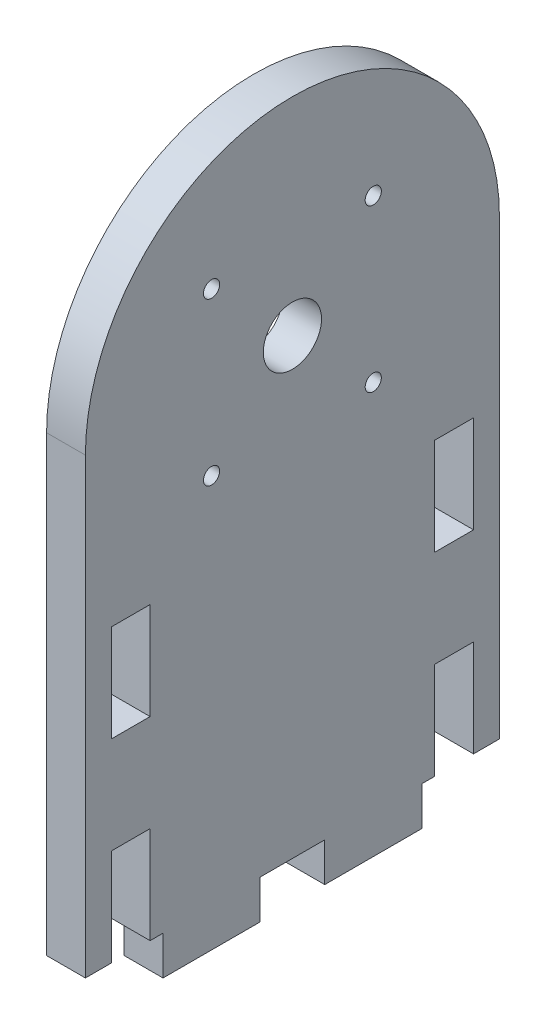
ISO-10303-21;
HEADER;
FILE_DESCRIPTION(('STEP AP214'),'2;1');
FILE_NAME('part.step','',(''),(''),'','','');
FILE_SCHEMA(('AUTOMOTIVE_DESIGN { 1 0 10303 214 1 1 1 1 }'));
ENDSEC;
DATA;
#1=APPLICATION_CONTEXT('core data for automotive mechanical design processes');
#2=APPLICATION_PROTOCOL_DEFINITION('international standard','automotive_design',2000,#1);
#3=PRODUCT_CONTEXT('',#1,'mechanical');
#4=PRODUCT('Part','Part','',(#3));
#5=PRODUCT_RELATED_PRODUCT_CATEGORY('part','',(#4));
#6=PRODUCT_DEFINITION_FORMATION('','',#4);
#7=PRODUCT_DEFINITION_CONTEXT('part definition',#1,'design');
#8=PRODUCT_DEFINITION('design','',#6,#7);
#9=PRODUCT_DEFINITION_SHAPE('','',#8);
#10=(LENGTH_UNIT() NAMED_UNIT(*) SI_UNIT(.MILLI.,.METRE.));
#11=(NAMED_UNIT(*) PLANE_ANGLE_UNIT() SI_UNIT($,.RADIAN.));
#12=(NAMED_UNIT(*) SI_UNIT($,.STERADIAN.) SOLID_ANGLE_UNIT());
#13=UNCERTAINTY_MEASURE_WITH_UNIT(LENGTH_MEASURE(1.E-05),#10,'distance_accuracy_value','');
#14=(GEOMETRIC_REPRESENTATION_CONTEXT(3) GLOBAL_UNCERTAINTY_ASSIGNED_CONTEXT((#13)) GLOBAL_UNIT_ASSIGNED_CONTEXT((#10,
#11,#12)) REPRESENTATION_CONTEXT('',''));
#15=CARTESIAN_POINT('',(0.,0.,0.));
#16=DIRECTION('',(0.,0.,1.));
#17=DIRECTION('',(1.,0.,0.));
#18=AXIS2_PLACEMENT_3D('',#15,#16,#17);
#19=CARTESIAN_POINT('',(3.,-35.,-32.));
#20=DIRECTION('',(0.,1.,0.));
#21=DIRECTION('',(0.,0.,1.));
#22=AXIS2_PLACEMENT_3D('',#19,#20,#21);
#23=PLANE('',#22);
#24=DIRECTION('',(0.,0.,-1.));
#25=VECTOR('',#24,1.);
#26=CARTESIAN_POINT('',(-3.,-35.,-32.));
#27=LINE('',#26,#25);
#28=CARTESIAN_POINT('',(-3.,-35.,5.));
#29=VERTEX_POINT('',#28);
#30=CARTESIAN_POINT('',(-3.,-35.,-5.));
#31=VERTEX_POINT('',#30);
#32=EDGE_CURVE('E490',#29,#31,#27,.T.);
#33=ORIENTED_EDGE('',*,*,#32,.T.);
#34=DIRECTION('',(1.,0.,0.));
#35=VECTOR('',#34,1.);
#36=CARTESIAN_POINT('',(-3.,-35.,-5.));
#37=LINE('',#36,#35);
#38=CARTESIAN_POINT('',(3.,-35.,-5.));
#39=VERTEX_POINT('',#38);
#40=EDGE_CURVE('E248',#31,#39,#37,.T.);
#41=ORIENTED_EDGE('',*,*,#40,.T.);
#42=DIRECTION('',(0.,0.,-1.));
#43=VECTOR('',#42,1.);
#44=CARTESIAN_POINT('',(3.,-35.,-32.));
#45=LINE('',#44,#43);
#46=CARTESIAN_POINT('',(3.,-35.,5.));
#47=VERTEX_POINT('',#46);
#48=EDGE_CURVE('E855',#47,#39,#45,.T.);
#49=ORIENTED_EDGE('',*,*,#48,.F.);
#50=DIRECTION('',(1.,0.,0.));
#51=VECTOR('',#50,1.);
#52=CARTESIAN_POINT('',(-3.,-35.,5.));
#53=LINE('',#52,#51);
#54=EDGE_CURVE('E279',#29,#47,#53,.T.);
#55=ORIENTED_EDGE('',*,*,#54,.F.);
#56=EDGE_LOOP('',(#33,#41,#49,#55));
#57=FACE_BOUND('',#56,.T.);
#58=ADVANCED_FACE('F37',(#57),#23,.F.);
#59=CARTESIAN_POINT('',(-3.,-35.,22.));
#60=VERTEX_POINT('',#59);
#61=CARTESIAN_POINT('',(-3.,-35.,20.));
#62=VERTEX_POINT('',#61);
#63=EDGE_CURVE('E446',#60,#62,#27,.T.);
#64=ORIENTED_EDGE('',*,*,#63,.T.);
#65=DIRECTION('',(1.,0.,0.));
#66=VECTOR('',#65,1.);
#67=CARTESIAN_POINT('',(-3.,-35.,20.));
#68=LINE('',#67,#66);
#69=CARTESIAN_POINT('',(3.,-35.,20.));
#70=VERTEX_POINT('',#69);
#71=EDGE_CURVE('E275',#62,#70,#68,.T.);
#72=ORIENTED_EDGE('',*,*,#71,.T.);
#73=CARTESIAN_POINT('',(3.,-35.,22.));
#74=VERTEX_POINT('',#73);
#75=EDGE_CURVE('E434',#74,#70,#45,.T.);
#76=ORIENTED_EDGE('',*,*,#75,.F.);
#77=DIRECTION('',(1.,0.,0.));
#78=VECTOR('',#77,1.);
#79=CARTESIAN_POINT('',(-3.,-35.,22.));
#80=LINE('',#79,#78);
#81=EDGE_CURVE('E308',#60,#74,#80,.T.);
#82=ORIENTED_EDGE('',*,*,#81,.F.);
#83=EDGE_LOOP('',(#64,#72,#76,#82));
#84=FACE_BOUND('',#83,.T.);
#85=ADVANCED_FACE('F507',(#84),#23,.F.);
#86=CARTESIAN_POINT('',(3.,-35.,-28.));
#87=VERTEX_POINT('',#86);
#88=CARTESIAN_POINT('',(3.,-35.,-32.));
#89=VERTEX_POINT('',#88);
#90=EDGE_CURVE('E453',#87,#89,#45,.T.);
#91=ORIENTED_EDGE('',*,*,#90,.F.);
#92=DIRECTION('',(1.,0.,0.));
#93=VECTOR('',#92,1.);
#94=CARTESIAN_POINT('',(-3.,-35.,-28.));
#95=LINE('',#94,#93);
#96=CARTESIAN_POINT('',(-3.,-35.,-28.));
#97=VERTEX_POINT('',#96);
#98=EDGE_CURVE('E298',#97,#87,#95,.T.);
#99=ORIENTED_EDGE('',*,*,#98,.F.);
#100=CARTESIAN_POINT('',(-3.,-35.,-32.));
#101=VERTEX_POINT('',#100);
#102=EDGE_CURVE('E427',#97,#101,#27,.T.);
#103=ORIENTED_EDGE('',*,*,#102,.T.);
#104=DIRECTION('',(-1.,0.,0.));
#105=VECTOR('',#104,1.);
#106=CARTESIAN_POINT('',(3.,-35.,-32.));
#107=LINE('',#106,#105);
#108=EDGE_CURVE('E11',#89,#101,#107,.T.);
#109=ORIENTED_EDGE('',*,*,#108,.F.);
#110=EDGE_LOOP('',(#91,#99,#103,#109));
#111=FACE_BOUND('',#110,.T.);
#112=ADVANCED_FACE('F488',(#111),#23,.F.);
#113=CARTESIAN_POINT('',(-3.,-35.,32.));
#114=VERTEX_POINT('',#113);
#115=CARTESIAN_POINT('',(-3.,-35.,28.));
#116=VERTEX_POINT('',#115);
#117=EDGE_CURVE('E442',#114,#116,#27,.T.);
#118=ORIENTED_EDGE('',*,*,#117,.T.);
#119=DIRECTION('',(1.,0.,0.));
#120=VECTOR('',#119,1.);
#121=CARTESIAN_POINT('',(-3.,-35.,28.));
#122=LINE('',#121,#120);
#123=CARTESIAN_POINT('',(3.,-35.,28.));
#124=VERTEX_POINT('',#123);
#125=EDGE_CURVE('E294',#116,#124,#122,.T.);
#126=ORIENTED_EDGE('',*,*,#125,.T.);
#127=CARTESIAN_POINT('',(3.,-35.,32.));
#128=VERTEX_POINT('',#127);
#129=EDGE_CURVE('E430',#128,#124,#45,.T.);
#130=ORIENTED_EDGE('',*,*,#129,.F.);
#131=DIRECTION('',(-1.,0.,0.));
#132=VECTOR('',#131,1.);
#133=CARTESIAN_POINT('',(3.,-35.,32.));
#134=LINE('',#133,#132);
#135=EDGE_CURVE('E441',#128,#114,#134,.T.);
#136=ORIENTED_EDGE('',*,*,#135,.T.);
#137=EDGE_LOOP('',(#118,#126,#130,#136));
#138=FACE_BOUND('',#137,.T.);
#139=ADVANCED_FACE('F477',(#138),#23,.F.);
#140=CARTESIAN_POINT('',(3.,35.,0.));
#141=DIRECTION('',(-1.,0.,0.));
#142=DIRECTION('',(0.,0.,1.));
#143=AXIS2_PLACEMENT_3D('',#140,#141,#142);
#144=PLANE('',#143);
#145=DIRECTION('',(0.,0.,1.));
#146=VECTOR('',#145,1.);
#147=CARTESIAN_POINT('',(3.,9.99999999999998,-28.));
#148=LINE('',#147,#146);
#149=CARTESIAN_POINT('',(3.,9.99999999999998,-28.));
#150=VERTEX_POINT('',#149);
#151=CARTESIAN_POINT('',(3.,9.99999999999998,-22.));
#152=VERTEX_POINT('',#151);
#153=EDGE_CURVE('E353',#150,#152,#148,.T.);
#154=ORIENTED_EDGE('',*,*,#153,.F.);
#155=DIRECTION('',(0.,1.,0.));
#156=VECTOR('',#155,1.);
#157=CARTESIAN_POINT('',(3.,9.99999999999998,-28.));
#158=LINE('',#157,#156);
#159=CARTESIAN_POINT('',(3.,-5.00000000000002,-28.));
#160=VERTEX_POINT('',#159);
#161=EDGE_CURVE('E278',#160,#150,#158,.T.);
#162=ORIENTED_EDGE('',*,*,#161,.F.);
#163=DIRECTION('',(0.,0.,-1.));
#164=VECTOR('',#163,1.);
#165=CARTESIAN_POINT('',(3.,-5.00000000000002,-28.));
#166=LINE('',#165,#164);
#167=CARTESIAN_POINT('',(3.,-5.00000000000002,-22.));
#168=VERTEX_POINT('',#167);
#169=EDGE_CURVE('E342',#168,#160,#166,.T.);
#170=ORIENTED_EDGE('',*,*,#169,.F.);
#171=DIRECTION('',(0.,-1.,0.));
#172=VECTOR('',#171,1.);
#173=CARTESIAN_POINT('',(3.,9.99999999999998,-22.));
#174=LINE('',#173,#172);
#175=EDGE_CURVE('E356',#152,#168,#174,.T.);
#176=ORIENTED_EDGE('',*,*,#175,.F.);
#177=EDGE_LOOP('',(#154,#162,#170,#176));
#178=FACE_BOUND('',#177,.T.);
#179=DIRECTION('',(0.,0.,-1.));
#180=VECTOR('',#179,1.);
#181=CARTESIAN_POINT('',(3.,-5.00000000000002,28.));
#182=LINE('',#181,#180);
#183=CARTESIAN_POINT('',(3.,-5.00000000000002,28.));
#184=VERTEX_POINT('',#183);
#185=CARTESIAN_POINT('',(3.,-5.00000000000002,22.));
#186=VERTEX_POINT('',#185);
#187=EDGE_CURVE('E383',#184,#186,#182,.T.);
#188=ORIENTED_EDGE('',*,*,#187,.F.);
#189=DIRECTION('',(0.,-1.,0.));
#190=VECTOR('',#189,1.);
#191=CARTESIAN_POINT('',(3.,9.99999999999997,28.));
#192=LINE('',#191,#190);
#193=CARTESIAN_POINT('',(3.,9.99999999999997,28.));
#194=VERTEX_POINT('',#193);
#195=EDGE_CURVE('E305',#194,#184,#192,.T.);
#196=ORIENTED_EDGE('',*,*,#195,.F.);
#197=DIRECTION('',(0.,0.,1.));
#198=VECTOR('',#197,1.);
#199=CARTESIAN_POINT('',(3.,9.99999999999997,28.));
#200=LINE('',#199,#198);
#201=CARTESIAN_POINT('',(3.,9.99999999999997,22.));
#202=VERTEX_POINT('',#201);
#203=EDGE_CURVE('E372',#202,#194,#200,.T.);
#204=ORIENTED_EDGE('',*,*,#203,.F.);
#205=DIRECTION('',(0.,1.,0.));
#206=VECTOR('',#205,1.);
#207=CARTESIAN_POINT('',(3.,9.99999999999997,22.));
#208=LINE('',#207,#206);
#209=EDGE_CURVE('E386',#186,#202,#208,.T.);
#210=ORIENTED_EDGE('',*,*,#209,.F.);
#211=EDGE_LOOP('',(#188,#196,#204,#210));
#212=FACE_BOUND('',#211,.T.);
#213=CARTESIAN_POINT('',(3.,47.4999999999926,12.5000000000029));
#214=DIRECTION('',(1.,0.,0.));
#215=DIRECTION('',(0.,0.,-1.));
#216=AXIS2_PLACEMENT_3D('',#213,#214,#215);
#217=CIRCLE('',#216,1.24999999999999);
#218=CARTESIAN_POINT('',(3.,47.4999999999926,11.2500000000029));
#219=VERTEX_POINT('',#218);
#220=EDGE_CURVE('E417',#219,#219,#217,.T.);
#221=ORIENTED_EDGE('',*,*,#220,.F.);
#222=EDGE_LOOP('',(#221));
#223=FACE_BOUND('',#222,.T.);
#224=DIRECTION('',(0.,0.,1.));
#225=VECTOR('',#224,1.);
#226=CARTESIAN_POINT('',(3.,-20.,-28.));
#227=LINE('',#226,#225);
#228=CARTESIAN_POINT('',(3.,-20.,-28.));
#229=VERTEX_POINT('',#228);
#230=CARTESIAN_POINT('',(3.,-20.,-22.));
#231=VERTEX_POINT('',#230);
#232=EDGE_CURVE('E325',#229,#231,#227,.T.);
#233=ORIENTED_EDGE('',*,*,#232,.F.);
#234=DIRECTION('',(0.,1.,0.));
#235=VECTOR('',#234,1.);
#236=CARTESIAN_POINT('',(3.,-20.,-28.));
#237=LINE('',#236,#235);
#238=EDGE_CURVE('E322',#87,#229,#237,.T.);
#239=ORIENTED_EDGE('',*,*,#238,.F.);
#240=ORIENTED_EDGE('',*,*,#90,.T.);
#241=DIRECTION('',(0.,1.,0.));
#242=VECTOR('',#241,1.);
#243=CARTESIAN_POINT('',(3.,35.,-32.));
#244=LINE('',#243,#242);
#245=CARTESIAN_POINT('',(3.,35.,-32.));
#246=VERTEX_POINT('',#245);
#247=EDGE_CURVE('E433',#89,#246,#244,.T.);
#248=ORIENTED_EDGE('',*,*,#247,.T.);
#249=CARTESIAN_POINT('',(3.,35.,0.));
#250=DIRECTION('',(1.,0.,0.));
#251=DIRECTION('',(0.,0.,1.));
#252=AXIS2_PLACEMENT_3D('',#249,#250,#251);
#253=CIRCLE('',#252,32.);
#254=CARTESIAN_POINT('',(3.,35.,32.));
#255=VERTEX_POINT('',#254);
#256=EDGE_CURVE('E437',#246,#255,#253,.T.);
#257=ORIENTED_EDGE('',*,*,#256,.T.);
#258=DIRECTION('',(0.,-1.,0.));
#259=VECTOR('',#258,1.);
#260=CARTESIAN_POINT('',(3.,-35.,32.));
#261=LINE('',#260,#259);
#262=EDGE_CURVE('E439',#255,#128,#261,.T.);
#263=ORIENTED_EDGE('',*,*,#262,.T.);
#264=ORIENTED_EDGE('',*,*,#129,.T.);
#265=DIRECTION('',(0.,-1.,0.));
#266=VECTOR('',#265,1.);
#267=CARTESIAN_POINT('',(3.,-20.,28.));
#268=LINE('',#267,#266);
#269=CARTESIAN_POINT('',(3.,-20.,28.));
#270=VERTEX_POINT('',#269);
#271=EDGE_CURVE('E295',#270,#124,#268,.T.);
#272=ORIENTED_EDGE('',*,*,#271,.F.);
#273=DIRECTION('',(0.,0.,1.));
#274=VECTOR('',#273,1.);
#275=CARTESIAN_POINT('',(3.,-20.,28.));
#276=LINE('',#275,#274);
#277=CARTESIAN_POINT('',(3.,-20.,22.));
#278=VERTEX_POINT('',#277);
#279=EDGE_CURVE('E288',#278,#270,#276,.T.);
#280=ORIENTED_EDGE('',*,*,#279,.F.);
#281=DIRECTION('',(0.,1.,0.));
#282=VECTOR('',#281,1.);
#283=CARTESIAN_POINT('',(3.,-20.,22.));
#284=LINE('',#283,#282);
#285=EDGE_CURVE('E297',#74,#278,#284,.T.);
#286=ORIENTED_EDGE('',*,*,#285,.F.);
#287=ORIENTED_EDGE('',*,*,#75,.T.);
#288=DIRECTION('',(0.,-1.,0.));
#289=VECTOR('',#288,1.);
#290=CARTESIAN_POINT('',(3.,-35.,20.));
#291=LINE('',#290,#289);
#292=CARTESIAN_POINT('',(3.,-41.,20.));
#293=VERTEX_POINT('',#292);
#294=EDGE_CURVE('E257',#70,#293,#291,.T.);
#295=ORIENTED_EDGE('',*,*,#294,.T.);
#296=DIRECTION('',(0.,0.,-1.));
#297=VECTOR('',#296,1.);
#298=CARTESIAN_POINT('',(3.,-41.,20.));
#299=LINE('',#298,#297);
#300=CARTESIAN_POINT('',(3.,-41.,5.));
#301=VERTEX_POINT('',#300);
#302=EDGE_CURVE('E272',#293,#301,#299,.T.);
#303=ORIENTED_EDGE('',*,*,#302,.T.);
#304=DIRECTION('',(0.,1.,0.));
#305=VECTOR('',#304,1.);
#306=CARTESIAN_POINT('',(3.,-35.,5.));
#307=LINE('',#306,#305);
#308=EDGE_CURVE('E59',#301,#47,#307,.T.);
#309=ORIENTED_EDGE('',*,*,#308,.T.);
#310=ORIENTED_EDGE('',*,*,#48,.T.);
#311=DIRECTION('',(0.,-1.,0.));
#312=VECTOR('',#311,1.);
#313=CARTESIAN_POINT('',(3.,-35.,-5.));
#314=LINE('',#313,#312);
#315=CARTESIAN_POINT('',(3.,-41.,-5.));
#316=VERTEX_POINT('',#315);
#317=EDGE_CURVE('E253',#39,#316,#314,.T.);
#318=ORIENTED_EDGE('',*,*,#317,.T.);
#319=DIRECTION('',(0.,0.,-1.));
#320=VECTOR('',#319,1.);
#321=CARTESIAN_POINT('',(3.,-41.,-5.));
#322=LINE('',#321,#320);
#323=CARTESIAN_POINT('',(3.,-41.,-20.));
#324=VERTEX_POINT('',#323);
#325=EDGE_CURVE('E228',#316,#324,#322,.T.);
#326=ORIENTED_EDGE('',*,*,#325,.T.);
#327=DIRECTION('',(0.,1.,0.));
#328=VECTOR('',#327,1.);
#329=CARTESIAN_POINT('',(3.,-35.,-20.));
#330=LINE('',#329,#328);
#331=CARTESIAN_POINT('',(3.,-35.,-20.));
#332=VERTEX_POINT('',#331);
#333=EDGE_CURVE('E52',#324,#332,#330,.T.);
#334=ORIENTED_EDGE('',*,*,#333,.T.);
#335=CARTESIAN_POINT('',(3.,-35.,-22.));
#336=VERTEX_POINT('',#335);
#337=EDGE_CURVE('E435',#332,#336,#45,.T.);
#338=ORIENTED_EDGE('',*,*,#337,.T.);
#339=DIRECTION('',(0.,-1.,0.));
#340=VECTOR('',#339,1.);
#341=CARTESIAN_POINT('',(3.,-20.,-22.));
#342=LINE('',#341,#340);
#343=EDGE_CURVE('E315',#231,#336,#342,.T.);
#344=ORIENTED_EDGE('',*,*,#343,.F.);
#345=EDGE_LOOP('',(#233,#239,#240,#248,#257,#263,#264,#272,#280,#286,#287,#295,#303,#309,#310,
#318,#326,#334,#338,#344));
#346=FACE_BOUND('',#345,.T.);
#347=CARTESIAN_POINT('',(3.,35.,0.));
#348=DIRECTION('',(1.,0.,0.));
#349=DIRECTION('',(0.,0.,-1.));
#350=AXIS2_PLACEMENT_3D('',#347,#348,#349);
#351=CIRCLE('',#350,4.5);
#352=CARTESIAN_POINT('',(3.,35.,-4.5));
#353=VERTEX_POINT('',#352);
#354=EDGE_CURVE('E424',#353,#353,#351,.T.);
#355=ORIENTED_EDGE('',*,*,#354,.F.);
#356=EDGE_LOOP('',(#355));
#357=FACE_BOUND('',#356,.T.);
#358=CARTESIAN_POINT('',(3.,22.4999999999926,12.5000000000029));
#359=DIRECTION('',(1.,0.,0.));
#360=DIRECTION('',(0.,0.,-1.));
#361=AXIS2_PLACEMENT_3D('',#358,#359,#360);
#362=CIRCLE('',#361,1.24999999999999);
#363=CARTESIAN_POINT('',(3.,22.4999999999926,11.2500000000029));
#364=VERTEX_POINT('',#363);
#365=EDGE_CURVE('E411',#364,#364,#362,.T.);
#366=ORIENTED_EDGE('',*,*,#365,.F.);
#367=EDGE_LOOP('',(#366));
#368=FACE_BOUND('',#367,.T.);
#369=CARTESIAN_POINT('',(3.,22.4999999999926,-12.4999999999971));
#370=DIRECTION('',(1.,0.,0.));
#371=DIRECTION('',(0.,0.,-1.));
#372=AXIS2_PLACEMENT_3D('',#369,#370,#371);
#373=CIRCLE('',#372,1.24999999999999);
#374=CARTESIAN_POINT('',(3.,22.4999999999926,-13.7499999999971));
#375=VERTEX_POINT('',#374);
#376=EDGE_CURVE('E405',#375,#375,#373,.T.);
#377=ORIENTED_EDGE('',*,*,#376,.F.);
#378=EDGE_LOOP('',(#377));
#379=FACE_BOUND('',#378,.T.);
#380=CARTESIAN_POINT('',(3.,47.4999999999926,-12.4999999999971));
#381=DIRECTION('',(1.,0.,0.));
#382=DIRECTION('',(0.,0.,-1.));
#383=AXIS2_PLACEMENT_3D('',#380,#381,#382);
#384=CIRCLE('',#383,1.24999999999999);
#385=CARTESIAN_POINT('',(3.,47.4999999999926,-13.7499999999971));
#386=VERTEX_POINT('',#385);
#387=EDGE_CURVE('E393',#386,#386,#384,.T.);
#388=ORIENTED_EDGE('',*,*,#387,.F.);
#389=EDGE_LOOP('',(#388));
#390=FACE_BOUND('',#389,.T.);
#391=ADVANCED_FACE('F480',(#178,#212,#223,#346,#357,#368,#379,#390),#144,.F.);
#392=CARTESIAN_POINT('',(-3.,35.,0.));
#393=DIRECTION('',(-1.,0.,0.));
#394=DIRECTION('',(0.,0.,1.));
#395=AXIS2_PLACEMENT_3D('',#392,#393,#394);
#396=PLANE('',#395);
#397=DIRECTION('',(0.,1.,0.));
#398=VECTOR('',#397,1.);
#399=CARTESIAN_POINT('',(-3.,9.99999999999998,-28.));
#400=LINE('',#399,#398);
#401=CARTESIAN_POINT('',(-3.,-5.00000000000002,-28.));
#402=VERTEX_POINT('',#401);
#403=CARTESIAN_POINT('',(-3.,9.99999999999998,-28.));
#404=VERTEX_POINT('',#403);
#405=EDGE_CURVE('E338',#402,#404,#400,.T.);
#406=ORIENTED_EDGE('',*,*,#405,.T.);
#407=DIRECTION('',(0.,0.,1.));
#408=VECTOR('',#407,1.);
#409=CARTESIAN_POINT('',(-3.,9.99999999999998,-28.));
#410=LINE('',#409,#408);
#411=CARTESIAN_POINT('',(-3.,9.99999999999998,-22.));
#412=VERTEX_POINT('',#411);
#413=EDGE_CURVE('E341',#404,#412,#410,.T.);
#414=ORIENTED_EDGE('',*,*,#413,.T.);
#415=DIRECTION('',(0.,-1.,0.));
#416=VECTOR('',#415,1.);
#417=CARTESIAN_POINT('',(-3.,9.99999999999998,-22.));
#418=LINE('',#417,#416);
#419=CARTESIAN_POINT('',(-3.,-5.00000000000002,-22.));
#420=VERTEX_POINT('',#419);
#421=EDGE_CURVE('E345',#412,#420,#418,.T.);
#422=ORIENTED_EDGE('',*,*,#421,.T.);
#423=DIRECTION('',(0.,0.,-1.));
#424=VECTOR('',#423,1.);
#425=CARTESIAN_POINT('',(-3.,-5.00000000000002,-28.));
#426=LINE('',#425,#424);
#427=EDGE_CURVE('E348',#420,#402,#426,.T.);
#428=ORIENTED_EDGE('',*,*,#427,.T.);
#429=EDGE_LOOP('',(#406,#414,#422,#428));
#430=FACE_BOUND('',#429,.T.);
#431=DIRECTION('',(0.,1.,0.));
#432=VECTOR('',#431,1.);
#433=CARTESIAN_POINT('',(-3.,-20.,-28.));
#434=LINE('',#433,#432);
#435=CARTESIAN_POINT('',(-3.,-20.,-28.));
#436=VERTEX_POINT('',#435);
#437=EDGE_CURVE('E312',#97,#436,#434,.T.);
#438=ORIENTED_EDGE('',*,*,#437,.T.);
#439=DIRECTION('',(0.,0.,1.));
#440=VECTOR('',#439,1.);
#441=CARTESIAN_POINT('',(-3.,-20.,-28.));
#442=LINE('',#441,#440);
#443=CARTESIAN_POINT('',(-3.,-20.,-22.));
#444=VERTEX_POINT('',#443);
#445=EDGE_CURVE('E314',#436,#444,#442,.T.);
#446=ORIENTED_EDGE('',*,*,#445,.T.);
#447=DIRECTION('',(0.,-1.,0.));
#448=VECTOR('',#447,1.);
#449=CARTESIAN_POINT('',(-3.,-20.,-22.));
#450=LINE('',#449,#448);
#451=CARTESIAN_POINT('',(-3.,-35.,-22.));
#452=VERTEX_POINT('',#451);
#453=EDGE_CURVE('E318',#444,#452,#450,.T.);
#454=ORIENTED_EDGE('',*,*,#453,.T.);
#455=CARTESIAN_POINT('',(-3.,-35.,-20.));
#456=VERTEX_POINT('',#455);
#457=EDGE_CURVE('E447',#456,#452,#27,.T.);
#458=ORIENTED_EDGE('',*,*,#457,.F.);
#459=DIRECTION('',(0.,1.,0.));
#460=VECTOR('',#459,1.);
#461=CARTESIAN_POINT('',(-3.,-35.,-20.));
#462=LINE('',#461,#460);
#463=CARTESIAN_POINT('',(-3.,-41.,-20.));
#464=VERTEX_POINT('',#463);
#465=EDGE_CURVE('E233',#464,#456,#462,.T.);
#466=ORIENTED_EDGE('',*,*,#465,.F.);
#467=DIRECTION('',(0.,0.,-1.));
#468=VECTOR('',#467,1.);
#469=CARTESIAN_POINT('',(-3.,-41.,-5.));
#470=LINE('',#469,#468);
#471=CARTESIAN_POINT('',(-3.,-41.,-5.));
#472=VERTEX_POINT('',#471);
#473=EDGE_CURVE('E227',#472,#464,#470,.T.);
#474=ORIENTED_EDGE('',*,*,#473,.F.);
#475=DIRECTION('',(0.,-1.,0.));
#476=VECTOR('',#475,1.);
#477=CARTESIAN_POINT('',(-3.,-35.,-5.));
#478=LINE('',#477,#476);
#479=EDGE_CURVE('E242',#31,#472,#478,.T.);
#480=ORIENTED_EDGE('',*,*,#479,.F.);
#481=ORIENTED_EDGE('',*,*,#32,.F.);
#482=DIRECTION('',(0.,1.,0.));
#483=VECTOR('',#482,1.);
#484=CARTESIAN_POINT('',(-3.,-35.,5.));
#485=LINE('',#484,#483);
#486=CARTESIAN_POINT('',(-3.,-41.,5.));
#487=VERTEX_POINT('',#486);
#488=EDGE_CURVE('E267',#487,#29,#485,.T.);
#489=ORIENTED_EDGE('',*,*,#488,.F.);
#490=DIRECTION('',(0.,0.,-1.));
#491=VECTOR('',#490,1.);
#492=CARTESIAN_POINT('',(-3.,-41.,20.));
#493=LINE('',#492,#491);
#494=CARTESIAN_POINT('',(-3.,-41.,20.));
#495=VERTEX_POINT('',#494);
#496=EDGE_CURVE('E264',#495,#487,#493,.T.);
#497=ORIENTED_EDGE('',*,*,#496,.F.);
#498=DIRECTION('',(0.,-1.,0.));
#499=VECTOR('',#498,1.);
#500=CARTESIAN_POINT('',(-3.,-35.,20.));
#501=LINE('',#500,#499);
#502=EDGE_CURVE('E261',#62,#495,#501,.T.);
#503=ORIENTED_EDGE('',*,*,#502,.F.);
#504=ORIENTED_EDGE('',*,*,#63,.F.);
#505=DIRECTION('',(0.,1.,0.));
#506=VECTOR('',#505,1.);
#507=CARTESIAN_POINT('',(-3.,-20.,22.));
#508=LINE('',#507,#506);
#509=CARTESIAN_POINT('',(-3.,-20.,22.));
#510=VERTEX_POINT('',#509);
#511=EDGE_CURVE('E287',#60,#510,#508,.T.);
#512=ORIENTED_EDGE('',*,*,#511,.T.);
#513=DIRECTION('',(0.,0.,1.));
#514=VECTOR('',#513,1.);
#515=CARTESIAN_POINT('',(-3.,-20.,28.));
#516=LINE('',#515,#514);
#517=CARTESIAN_POINT('',(-3.,-20.,28.));
#518=VERTEX_POINT('',#517);
#519=EDGE_CURVE('E291',#510,#518,#516,.T.);
#520=ORIENTED_EDGE('',*,*,#519,.T.);
#521=DIRECTION('',(0.,-1.,0.));
#522=VECTOR('',#521,1.);
#523=CARTESIAN_POINT('',(-3.,-20.,28.));
#524=LINE('',#523,#522);
#525=EDGE_CURVE('E284',#518,#116,#524,.T.);
#526=ORIENTED_EDGE('',*,*,#525,.T.);
#527=ORIENTED_EDGE('',*,*,#117,.F.);
#528=DIRECTION('',(0.,-1.,0.));
#529=VECTOR('',#528,1.);
#530=CARTESIAN_POINT('',(-3.,-35.,32.));
#531=LINE('',#530,#529);
#532=CARTESIAN_POINT('',(-3.,35.,32.));
#533=VERTEX_POINT('',#532);
#534=EDGE_CURVE('E451',#533,#114,#531,.T.);
#535=ORIENTED_EDGE('',*,*,#534,.F.);
#536=CARTESIAN_POINT('',(-3.,35.,0.));
#537=DIRECTION('',(1.,0.,0.));
#538=DIRECTION('',(0.,0.,1.));
#539=AXIS2_PLACEMENT_3D('',#536,#537,#538);
#540=CIRCLE('',#539,32.);
#541=CARTESIAN_POINT('',(-3.,35.,-32.));
#542=VERTEX_POINT('',#541);
#543=EDGE_CURVE('E449',#542,#533,#540,.T.);
#544=ORIENTED_EDGE('',*,*,#543,.F.);
#545=DIRECTION('',(0.,1.,0.));
#546=VECTOR('',#545,1.);
#547=CARTESIAN_POINT('',(-3.,35.,-32.));
#548=LINE('',#547,#546);
#549=EDGE_CURVE('E445',#101,#542,#548,.T.);
#550=ORIENTED_EDGE('',*,*,#549,.F.);
#551=ORIENTED_EDGE('',*,*,#102,.F.);
#552=EDGE_LOOP('',(#438,#446,#454,#458,#466,#474,#480,#481,#489,#497,#503,#504,#512,#520,#526,
#527,#535,#544,#550,#551));
#553=FACE_BOUND('',#552,.T.);
#554=DIRECTION('',(0.,-1.,0.));
#555=VECTOR('',#554,1.);
#556=CARTESIAN_POINT('',(-3.,9.99999999999997,28.));
#557=LINE('',#556,#555);
#558=CARTESIAN_POINT('',(-3.,9.99999999999997,28.));
#559=VERTEX_POINT('',#558);
#560=CARTESIAN_POINT('',(-3.,-5.00000000000002,28.));
#561=VERTEX_POINT('',#560);
#562=EDGE_CURVE('E368',#559,#561,#557,.T.);
#563=ORIENTED_EDGE('',*,*,#562,.T.);
#564=DIRECTION('',(0.,0.,-1.));
#565=VECTOR('',#564,1.);
#566=CARTESIAN_POINT('',(-3.,-5.00000000000002,28.));
#567=LINE('',#566,#565);
#568=CARTESIAN_POINT('',(-3.,-5.00000000000002,22.));
#569=VERTEX_POINT('',#568);
#570=EDGE_CURVE('E371',#561,#569,#567,.T.);
#571=ORIENTED_EDGE('',*,*,#570,.T.);
#572=DIRECTION('',(0.,1.,0.));
#573=VECTOR('',#572,1.);
#574=CARTESIAN_POINT('',(-3.,9.99999999999997,22.));
#575=LINE('',#574,#573);
#576=CARTESIAN_POINT('',(-3.,9.99999999999997,22.));
#577=VERTEX_POINT('',#576);
#578=EDGE_CURVE('E375',#569,#577,#575,.T.);
#579=ORIENTED_EDGE('',*,*,#578,.T.);
#580=DIRECTION('',(0.,0.,1.));
#581=VECTOR('',#580,1.);
#582=CARTESIAN_POINT('',(-3.,9.99999999999997,28.));
#583=LINE('',#582,#581);
#584=EDGE_CURVE('E378',#577,#559,#583,.T.);
#585=ORIENTED_EDGE('',*,*,#584,.T.);
#586=EDGE_LOOP('',(#563,#571,#579,#585));
#587=FACE_BOUND('',#586,.T.);
#588=CARTESIAN_POINT('',(-3.,47.4999999999926,-12.4999999999971));
#589=DIRECTION('',(-1.,0.,0.));
#590=DIRECTION('',(0.,0.,1.));
#591=AXIS2_PLACEMENT_3D('',#588,#589,#590);
#592=CIRCLE('',#591,1.24999999999999);
#593=CARTESIAN_POINT('',(-3.,47.4999999999926,-11.2499999999971));
#594=VERTEX_POINT('',#593);
#595=EDGE_CURVE('E402',#594,#594,#592,.T.);
#596=ORIENTED_EDGE('',*,*,#595,.F.);
#597=EDGE_LOOP('',(#596));
#598=FACE_BOUND('',#597,.T.);
#599=CARTESIAN_POINT('',(-3.,22.4999999999926,-12.4999999999971));
#600=DIRECTION('',(-1.,0.,0.));
#601=DIRECTION('',(0.,0.,1.));
#602=AXIS2_PLACEMENT_3D('',#599,#600,#601);
#603=CIRCLE('',#602,1.24999999999999);
#604=CARTESIAN_POINT('',(-3.,22.4999999999926,-11.2499999999971));
#605=VERTEX_POINT('',#604);
#606=EDGE_CURVE('E408',#605,#605,#603,.T.);
#607=ORIENTED_EDGE('',*,*,#606,.F.);
#608=EDGE_LOOP('',(#607));
#609=FACE_BOUND('',#608,.T.);
#610=CARTESIAN_POINT('',(-3.,22.4999999999926,12.5000000000029));
#611=DIRECTION('',(-1.,0.,0.));
#612=DIRECTION('',(0.,0.,1.));
#613=AXIS2_PLACEMENT_3D('',#610,#611,#612);
#614=CIRCLE('',#613,1.24999999999999);
#615=CARTESIAN_POINT('',(-3.,22.4999999999926,13.7500000000029));
#616=VERTEX_POINT('',#615);
#617=EDGE_CURVE('E414',#616,#616,#614,.T.);
#618=ORIENTED_EDGE('',*,*,#617,.F.);
#619=EDGE_LOOP('',(#618));
#620=FACE_BOUND('',#619,.T.);
#621=CARTESIAN_POINT('',(-3.,47.4999999999926,12.5000000000029));
#622=DIRECTION('',(-1.,0.,0.));
#623=DIRECTION('',(0.,0.,1.));
#624=AXIS2_PLACEMENT_3D('',#621,#622,#623);
#625=CIRCLE('',#624,1.24999999999999);
#626=CARTESIAN_POINT('',(-3.,47.4999999999926,13.7500000000029));
#627=VERTEX_POINT('',#626);
#628=EDGE_CURVE('E420',#627,#627,#625,.T.);
#629=ORIENTED_EDGE('',*,*,#628,.F.);
#630=EDGE_LOOP('',(#629));
#631=FACE_BOUND('',#630,.T.);
#632=CARTESIAN_POINT('',(-3.,35.,0.));
#633=DIRECTION('',(1.,0.,0.));
#634=DIRECTION('',(0.,0.,-1.));
#635=AXIS2_PLACEMENT_3D('',#632,#633,#634);
#636=CIRCLE('',#635,4.5);
#637=CARTESIAN_POINT('',(-3.,35.,-4.5));
#638=VERTEX_POINT('',#637);
#639=EDGE_CURVE('E423',#638,#638,#636,.T.);
#640=ORIENTED_EDGE('',*,*,#639,.T.);
#641=EDGE_LOOP('',(#640));
#642=FACE_BOUND('',#641,.T.);
#643=ADVANCED_FACE('F239',(#430,#553,#587,#598,#609,#620,#631,#642),#396,.T.);
#644=ORIENTED_EDGE('',*,*,#337,.F.);
#645=DIRECTION('',(1.,0.,0.));
#646=VECTOR('',#645,1.);
#647=CARTESIAN_POINT('',(-3.,-35.,-20.));
#648=LINE('',#647,#646);
#649=EDGE_CURVE('E258',#456,#332,#648,.T.);
#650=ORIENTED_EDGE('',*,*,#649,.F.);
#651=ORIENTED_EDGE('',*,*,#457,.T.);
#652=DIRECTION('',(1.,0.,0.));
#653=VECTOR('',#652,1.);
#654=CARTESIAN_POINT('',(-3.,-35.,-22.));
#655=LINE('',#654,#653);
#656=EDGE_CURVE('E332',#452,#336,#655,.T.);
#657=ORIENTED_EDGE('',*,*,#656,.T.);
#658=EDGE_LOOP('',(#644,#650,#651,#657));
#659=FACE_BOUND('',#658,.T.);
#660=ADVANCED_FACE('F39',(#659),#23,.F.);
#661=CARTESIAN_POINT('',(3.,35.,-32.));
#662=DIRECTION('',(0.,0.,1.));
#663=DIRECTION('',(0.,-1.,0.));
#664=AXIS2_PLACEMENT_3D('',#661,#662,#663);
#665=PLANE('',#664);
#666=ORIENTED_EDGE('',*,*,#549,.T.);
#667=DIRECTION('',(-1.,0.,0.));
#668=VECTOR('',#667,1.);
#669=CARTESIAN_POINT('',(3.,35.,-32.));
#670=LINE('',#669,#668);
#671=EDGE_CURVE('E45',#246,#542,#670,.T.);
#672=ORIENTED_EDGE('',*,*,#671,.F.);
#673=ORIENTED_EDGE('',*,*,#247,.F.);
#674=ORIENTED_EDGE('',*,*,#108,.T.);
#675=EDGE_LOOP('',(#666,#672,#673,#674));
#676=FACE_BOUND('',#675,.T.);
#677=ADVANCED_FACE('F486',(#676),#665,.F.);
#678=CARTESIAN_POINT('',(3.,35.,0.));
#679=DIRECTION('',(-1.,0.,0.));
#680=DIRECTION('',(0.,0.,1.));
#681=AXIS2_PLACEMENT_3D('',#678,#679,#680);
#682=CYLINDRICAL_SURFACE('',#681,32.);
#683=ORIENTED_EDGE('',*,*,#543,.T.);
#684=DIRECTION('',(-1.,0.,0.));
#685=VECTOR('',#684,1.);
#686=CARTESIAN_POINT('',(3.,35.,32.));
#687=LINE('',#686,#685);
#688=EDGE_CURVE('E456',#255,#533,#687,.T.);
#689=ORIENTED_EDGE('',*,*,#688,.F.);
#690=ORIENTED_EDGE('',*,*,#256,.F.);
#691=ORIENTED_EDGE('',*,*,#671,.T.);
#692=EDGE_LOOP('',(#683,#689,#690,#691));
#693=FACE_BOUND('',#692,.T.);
#694=ADVANCED_FACE('F463',(#693),#682,.T.);
#695=CARTESIAN_POINT('',(3.,-35.,32.));
#696=DIRECTION('',(0.,0.,-1.));
#697=DIRECTION('',(0.,1.,0.));
#698=AXIS2_PLACEMENT_3D('',#695,#696,#697);
#699=PLANE('',#698);
#700=ORIENTED_EDGE('',*,*,#534,.T.);
#701=ORIENTED_EDGE('',*,*,#135,.F.);
#702=ORIENTED_EDGE('',*,*,#262,.F.);
#703=ORIENTED_EDGE('',*,*,#688,.T.);
#704=EDGE_LOOP('',(#700,#701,#702,#703));
#705=FACE_BOUND('',#704,.T.);
#706=ADVANCED_FACE('F473',(#705),#699,.F.);
#707=CARTESIAN_POINT('',(3.,35.,0.));
#708=DIRECTION('',(-1.,0.,0.));
#709=DIRECTION('',(0.,0.,1.));
#710=AXIS2_PLACEMENT_3D('',#707,#708,#709);
#711=CYLINDRICAL_SURFACE('',#710,4.5);
#712=ORIENTED_EDGE('',*,*,#354,.T.);
#713=EDGE_LOOP('',(#712));
#714=FACE_BOUND('',#713,.T.);
#715=ORIENTED_EDGE('',*,*,#639,.F.);
#716=EDGE_LOOP('',(#715));
#717=FACE_BOUND('',#716,.T.);
#718=ADVANCED_FACE('F698',(#714,#717),#711,.F.);
#719=CARTESIAN_POINT('',(3.,47.4999999999926,12.5000000000029));
#720=DIRECTION('',(1.,0.,0.));
#721=DIRECTION('',(0.,0.,-1.));
#722=AXIS2_PLACEMENT_3D('',#719,#720,#721);
#723=CYLINDRICAL_SURFACE('',#722,1.24999999999999);
#724=ORIENTED_EDGE('',*,*,#220,.T.);
#725=EDGE_LOOP('',(#724));
#726=FACE_BOUND('',#725,.T.);
#727=ORIENTED_EDGE('',*,*,#628,.T.);
#728=EDGE_LOOP('',(#727));
#729=FACE_BOUND('',#728,.T.);
#730=ADVANCED_FACE('F694',(#726,#729),#723,.F.);
#731=CARTESIAN_POINT('',(3.,22.4999999999926,12.5000000000029));
#732=DIRECTION('',(1.,0.,0.));
#733=DIRECTION('',(0.,0.,-1.));
#734=AXIS2_PLACEMENT_3D('',#731,#732,#733);
#735=CYLINDRICAL_SURFACE('',#734,1.24999999999999);
#736=ORIENTED_EDGE('',*,*,#365,.T.);
#737=EDGE_LOOP('',(#736));
#738=FACE_BOUND('',#737,.T.);
#739=ORIENTED_EDGE('',*,*,#617,.T.);
#740=EDGE_LOOP('',(#739));
#741=FACE_BOUND('',#740,.T.);
#742=ADVANCED_FACE('F690',(#738,#741),#735,.F.);
#743=CARTESIAN_POINT('',(3.,22.4999999999926,-12.4999999999971));
#744=DIRECTION('',(1.,0.,0.));
#745=DIRECTION('',(0.,0.,-1.));
#746=AXIS2_PLACEMENT_3D('',#743,#744,#745);
#747=CYLINDRICAL_SURFACE('',#746,1.24999999999999);
#748=ORIENTED_EDGE('',*,*,#376,.T.);
#749=EDGE_LOOP('',(#748));
#750=FACE_BOUND('',#749,.T.);
#751=ORIENTED_EDGE('',*,*,#606,.T.);
#752=EDGE_LOOP('',(#751));
#753=FACE_BOUND('',#752,.T.);
#754=ADVANCED_FACE('F527',(#750,#753),#747,.F.);
#755=CARTESIAN_POINT('',(3.,47.4999999999926,-12.4999999999971));
#756=DIRECTION('',(1.,0.,0.));
#757=DIRECTION('',(0.,0.,-1.));
#758=AXIS2_PLACEMENT_3D('',#755,#756,#757);
#759=CYLINDRICAL_SURFACE('',#758,1.24999999999999);
#760=ORIENTED_EDGE('',*,*,#387,.T.);
#761=EDGE_LOOP('',(#760));
#762=FACE_BOUND('',#761,.T.);
#763=ORIENTED_EDGE('',*,*,#595,.T.);
#764=EDGE_LOOP('',(#763));
#765=FACE_BOUND('',#764,.T.);
#766=ADVANCED_FACE('F520',(#762,#765),#759,.F.);
#767=CARTESIAN_POINT('',(-3.,-20.,28.));
#768=DIRECTION('',(0.,0.,1.));
#769=DIRECTION('',(1.,0.,0.));
#770=AXIS2_PLACEMENT_3D('',#767,#768,#769);
#771=PLANE('',#770);
#772=ORIENTED_EDGE('',*,*,#271,.T.);
#773=ORIENTED_EDGE('',*,*,#125,.F.);
#774=ORIENTED_EDGE('',*,*,#525,.F.);
#775=DIRECTION('',(1.,0.,0.));
#776=VECTOR('',#775,1.);
#777=CARTESIAN_POINT('',(-3.,-20.,28.));
#778=LINE('',#777,#776);
#779=EDGE_CURVE('E303',#518,#270,#778,.T.);
#780=ORIENTED_EDGE('',*,*,#779,.T.);
#781=EDGE_LOOP('',(#772,#773,#774,#780));
#782=FACE_BOUND('',#781,.T.);
#783=ADVANCED_FACE('F518',(#782),#771,.F.);
#784=CARTESIAN_POINT('',(-3.,-20.,28.));
#785=DIRECTION('',(0.,1.,0.));
#786=DIRECTION('',(0.,0.,1.));
#787=AXIS2_PLACEMENT_3D('',#784,#785,#786);
#788=PLANE('',#787);
#789=ORIENTED_EDGE('',*,*,#279,.T.);
#790=ORIENTED_EDGE('',*,*,#779,.F.);
#791=ORIENTED_EDGE('',*,*,#519,.F.);
#792=DIRECTION('',(1.,0.,0.));
#793=VECTOR('',#792,1.);
#794=CARTESIAN_POINT('',(-3.,-20.,22.));
#795=LINE('',#794,#793);
#796=EDGE_CURVE('E306',#510,#278,#795,.T.);
#797=ORIENTED_EDGE('',*,*,#796,.T.);
#798=EDGE_LOOP('',(#789,#790,#791,#797));
#799=FACE_BOUND('',#798,.T.);
#800=ADVANCED_FACE('F514',(#799),#788,.F.);
#801=CARTESIAN_POINT('',(-3.,-20.,22.));
#802=DIRECTION('',(0.,0.,-1.));
#803=DIRECTION('',(0.,1.,0.));
#804=AXIS2_PLACEMENT_3D('',#801,#802,#803);
#805=PLANE('',#804);
#806=ORIENTED_EDGE('',*,*,#285,.T.);
#807=ORIENTED_EDGE('',*,*,#796,.F.);
#808=ORIENTED_EDGE('',*,*,#511,.F.);
#809=ORIENTED_EDGE('',*,*,#81,.T.);
#810=EDGE_LOOP('',(#806,#807,#808,#809));
#811=FACE_BOUND('',#810,.T.);
#812=ADVANCED_FACE('F512',(#811),#805,.F.);
#813=CARTESIAN_POINT('',(-3.,-20.,-28.));
#814=DIRECTION('',(0.,0.,-1.));
#815=DIRECTION('',(-1.,0.,0.));
#816=AXIS2_PLACEMENT_3D('',#813,#814,#815);
#817=PLANE('',#816);
#818=ORIENTED_EDGE('',*,*,#238,.T.);
#819=DIRECTION('',(1.,0.,0.));
#820=VECTOR('',#819,1.);
#821=CARTESIAN_POINT('',(-3.,-20.,-28.));
#822=LINE('',#821,#820);
#823=EDGE_CURVE('E321',#436,#229,#822,.T.);
#824=ORIENTED_EDGE('',*,*,#823,.F.);
#825=ORIENTED_EDGE('',*,*,#437,.F.);
#826=ORIENTED_EDGE('',*,*,#98,.T.);
#827=EDGE_LOOP('',(#818,#824,#825,#826));
#828=FACE_BOUND('',#827,.T.);
#829=ADVANCED_FACE('F644',(#828),#817,.F.);
#830=CARTESIAN_POINT('',(-3.,-20.,-22.));
#831=DIRECTION('',(0.,0.,1.));
#832=DIRECTION('',(0.,-1.,0.));
#833=AXIS2_PLACEMENT_3D('',#830,#831,#832);
#834=PLANE('',#833);
#835=ORIENTED_EDGE('',*,*,#343,.T.);
#836=ORIENTED_EDGE('',*,*,#656,.F.);
#837=ORIENTED_EDGE('',*,*,#453,.F.);
#838=DIRECTION('',(1.,0.,0.));
#839=VECTOR('',#838,1.);
#840=CARTESIAN_POINT('',(-3.,-20.,-22.));
#841=LINE('',#840,#839);
#842=EDGE_CURVE('E335',#444,#231,#841,.T.);
#843=ORIENTED_EDGE('',*,*,#842,.T.);
#844=EDGE_LOOP('',(#835,#836,#837,#843));
#845=FACE_BOUND('',#844,.T.);
#846=ADVANCED_FACE('F648',(#845),#834,.F.);
#847=CARTESIAN_POINT('',(-3.,-20.,-28.));
#848=DIRECTION('',(0.,1.,0.));
#849=DIRECTION('',(0.,0.,1.));
#850=AXIS2_PLACEMENT_3D('',#847,#848,#849);
#851=PLANE('',#850);
#852=ORIENTED_EDGE('',*,*,#232,.T.);
#853=ORIENTED_EDGE('',*,*,#842,.F.);
#854=ORIENTED_EDGE('',*,*,#445,.F.);
#855=ORIENTED_EDGE('',*,*,#823,.T.);
#856=EDGE_LOOP('',(#852,#853,#854,#855));
#857=FACE_BOUND('',#856,.T.);
#858=ADVANCED_FACE('F654',(#857),#851,.F.);
#859=CARTESIAN_POINT('',(-3.,9.99999999999997,28.));
#860=DIRECTION('',(0.,0.,1.));
#861=DIRECTION('',(1.,0.,0.));
#862=AXIS2_PLACEMENT_3D('',#859,#860,#861);
#863=PLANE('',#862);
#864=ORIENTED_EDGE('',*,*,#195,.T.);
#865=DIRECTION('',(1.,0.,0.));
#866=VECTOR('',#865,1.);
#867=CARTESIAN_POINT('',(-3.,-5.00000000000002,28.));
#868=LINE('',#867,#866);
#869=EDGE_CURVE('E381',#561,#184,#868,.T.);
#870=ORIENTED_EDGE('',*,*,#869,.F.);
#871=ORIENTED_EDGE('',*,*,#562,.F.);
#872=DIRECTION('',(1.,0.,0.));
#873=VECTOR('',#872,1.);
#874=CARTESIAN_POINT('',(-3.,9.99999999999997,28.));
#875=LINE('',#874,#873);
#876=EDGE_CURVE('E391',#559,#194,#875,.T.);
#877=ORIENTED_EDGE('',*,*,#876,.T.);
#878=EDGE_LOOP('',(#864,#870,#871,#877));
#879=FACE_BOUND('',#878,.T.);
#880=ADVANCED_FACE('F677',(#879),#863,.F.);
#881=CARTESIAN_POINT('',(-3.,9.99999999999997,28.));
#882=DIRECTION('',(0.,1.,0.));
#883=DIRECTION('',(0.,0.,1.));
#884=AXIS2_PLACEMENT_3D('',#881,#882,#883);
#885=PLANE('',#884);
#886=ORIENTED_EDGE('',*,*,#203,.T.);
#887=ORIENTED_EDGE('',*,*,#876,.F.);
#888=ORIENTED_EDGE('',*,*,#584,.F.);
#889=DIRECTION('',(1.,0.,0.));
#890=VECTOR('',#889,1.);
#891=CARTESIAN_POINT('',(-3.,9.99999999999997,22.));
#892=LINE('',#891,#890);
#893=EDGE_CURVE('E394',#577,#202,#892,.T.);
#894=ORIENTED_EDGE('',*,*,#893,.T.);
#895=EDGE_LOOP('',(#886,#887,#888,#894));
#896=FACE_BOUND('',#895,.T.);
#897=ADVANCED_FACE('F673',(#896),#885,.F.);
#898=CARTESIAN_POINT('',(-3.,9.99999999999997,22.));
#899=DIRECTION('',(0.,0.,-1.));
#900=DIRECTION('',(0.,1.,0.));
#901=AXIS2_PLACEMENT_3D('',#898,#899,#900);
#902=PLANE('',#901);
#903=ORIENTED_EDGE('',*,*,#209,.T.);
#904=ORIENTED_EDGE('',*,*,#893,.F.);
#905=ORIENTED_EDGE('',*,*,#578,.F.);
#906=DIRECTION('',(1.,0.,0.));
#907=VECTOR('',#906,1.);
#908=CARTESIAN_POINT('',(-3.,-5.00000000000002,22.));
#909=LINE('',#908,#907);
#910=EDGE_CURVE('E396',#569,#186,#909,.T.);
#911=ORIENTED_EDGE('',*,*,#910,.T.);
#912=EDGE_LOOP('',(#903,#904,#905,#911));
#913=FACE_BOUND('',#912,.T.);
#914=ADVANCED_FACE('F676',(#913),#902,.F.);
#915=CARTESIAN_POINT('',(-3.,-5.00000000000002,28.));
#916=DIRECTION('',(0.,-1.,0.));
#917=DIRECTION('',(0.,0.,-1.));
#918=AXIS2_PLACEMENT_3D('',#915,#916,#917);
#919=PLANE('',#918);
#920=ORIENTED_EDGE('',*,*,#187,.T.);
#921=ORIENTED_EDGE('',*,*,#910,.F.);
#922=ORIENTED_EDGE('',*,*,#570,.F.);
#923=ORIENTED_EDGE('',*,*,#869,.T.);
#924=EDGE_LOOP('',(#920,#921,#922,#923));
#925=FACE_BOUND('',#924,.T.);
#926=ADVANCED_FACE('F671',(#925),#919,.F.);
#927=CARTESIAN_POINT('',(-3.,9.99999999999998,-28.));
#928=DIRECTION('',(0.,0.,-1.));
#929=DIRECTION('',(-1.,0.,0.));
#930=AXIS2_PLACEMENT_3D('',#927,#928,#929);
#931=PLANE('',#930);
#932=ORIENTED_EDGE('',*,*,#161,.T.);
#933=DIRECTION('',(1.,0.,0.));
#934=VECTOR('',#933,1.);
#935=CARTESIAN_POINT('',(-3.,9.99999999999998,-28.));
#936=LINE('',#935,#934);
#937=EDGE_CURVE('E351',#404,#150,#936,.T.);
#938=ORIENTED_EDGE('',*,*,#937,.F.);
#939=ORIENTED_EDGE('',*,*,#405,.F.);
#940=DIRECTION('',(1.,0.,0.));
#941=VECTOR('',#940,1.);
#942=CARTESIAN_POINT('',(-3.,-5.00000000000002,-28.));
#943=LINE('',#942,#941);
#944=EDGE_CURVE('E326',#402,#160,#943,.T.);
#945=ORIENTED_EDGE('',*,*,#944,.T.);
#946=EDGE_LOOP('',(#932,#938,#939,#945));
#947=FACE_BOUND('',#946,.T.);
#948=ADVANCED_FACE('F662',(#947),#931,.F.);
#949=CARTESIAN_POINT('',(-3.,-5.00000000000002,-28.));
#950=DIRECTION('',(0.,-1.,0.));
#951=DIRECTION('',(0.,0.,-1.));
#952=AXIS2_PLACEMENT_3D('',#949,#950,#951);
#953=PLANE('',#952);
#954=ORIENTED_EDGE('',*,*,#169,.T.);
#955=ORIENTED_EDGE('',*,*,#944,.F.);
#956=ORIENTED_EDGE('',*,*,#427,.F.);
#957=DIRECTION('',(1.,0.,0.));
#958=VECTOR('',#957,1.);
#959=CARTESIAN_POINT('',(-3.,-5.00000000000002,-22.));
#960=LINE('',#959,#958);
#961=EDGE_CURVE('E362',#420,#168,#960,.T.);
#962=ORIENTED_EDGE('',*,*,#961,.T.);
#963=EDGE_LOOP('',(#954,#955,#956,#962));
#964=FACE_BOUND('',#963,.T.);
#965=ADVANCED_FACE('F658',(#964),#953,.F.);
#966=CARTESIAN_POINT('',(-3.,9.99999999999998,-22.));
#967=DIRECTION('',(0.,0.,1.));
#968=DIRECTION('',(0.,-1.,0.));
#969=AXIS2_PLACEMENT_3D('',#966,#967,#968);
#970=PLANE('',#969);
#971=ORIENTED_EDGE('',*,*,#175,.T.);
#972=ORIENTED_EDGE('',*,*,#961,.F.);
#973=ORIENTED_EDGE('',*,*,#421,.F.);
#974=DIRECTION('',(1.,0.,0.));
#975=VECTOR('',#974,1.);
#976=CARTESIAN_POINT('',(-3.,9.99999999999998,-22.));
#977=LINE('',#976,#975);
#978=EDGE_CURVE('E364',#412,#152,#977,.T.);
#979=ORIENTED_EDGE('',*,*,#978,.T.);
#980=EDGE_LOOP('',(#971,#972,#973,#979));
#981=FACE_BOUND('',#980,.T.);
#982=ADVANCED_FACE('F661',(#981),#970,.F.);
#983=CARTESIAN_POINT('',(-3.,9.99999999999998,-28.));
#984=DIRECTION('',(0.,1.,0.));
#985=DIRECTION('',(0.,0.,1.));
#986=AXIS2_PLACEMENT_3D('',#983,#984,#985);
#987=PLANE('',#986);
#988=ORIENTED_EDGE('',*,*,#153,.T.);
#989=ORIENTED_EDGE('',*,*,#978,.F.);
#990=ORIENTED_EDGE('',*,*,#413,.F.);
#991=ORIENTED_EDGE('',*,*,#937,.T.);
#992=EDGE_LOOP('',(#988,#989,#990,#991));
#993=FACE_BOUND('',#992,.T.);
#994=ADVANCED_FACE('F596',(#993),#987,.F.);
#995=CARTESIAN_POINT('',(-3.,-35.,20.));
#996=DIRECTION('',(0.,0.,1.));
#997=DIRECTION('',(1.,0.,0.));
#998=AXIS2_PLACEMENT_3D('',#995,#996,#997);
#999=PLANE('',#998);
#1000=ORIENTED_EDGE('',*,*,#294,.F.);
#1001=ORIENTED_EDGE('',*,*,#71,.F.);
#1002=ORIENTED_EDGE('',*,*,#502,.T.);
#1003=DIRECTION('',(1.,0.,0.));
#1004=VECTOR('',#1003,1.);
#1005=CARTESIAN_POINT('',(-3.,-41.,20.));
#1006=LINE('',#1005,#1004);
#1007=EDGE_CURVE('E269',#495,#293,#1006,.T.);
#1008=ORIENTED_EDGE('',*,*,#1007,.T.);
#1009=EDGE_LOOP('',(#1000,#1001,#1002,#1008));
#1010=FACE_BOUND('',#1009,.T.);
#1011=ADVANCED_FACE('F503',(#1010),#999,.T.);
#1012=CARTESIAN_POINT('',(-3.,-35.,5.));
#1013=DIRECTION('',(0.,0.,-1.));
#1014=DIRECTION('',(-1.,0.,0.));
#1015=AXIS2_PLACEMENT_3D('',#1012,#1013,#1014);
#1016=PLANE('',#1015);
#1017=ORIENTED_EDGE('',*,*,#308,.F.);
#1018=DIRECTION('',(1.,0.,0.));
#1019=VECTOR('',#1018,1.);
#1020=CARTESIAN_POINT('',(-3.,-41.,5.));
#1021=LINE('',#1020,#1019);
#1022=EDGE_CURVE('E281',#487,#301,#1021,.T.);
#1023=ORIENTED_EDGE('',*,*,#1022,.F.);
#1024=ORIENTED_EDGE('',*,*,#488,.T.);
#1025=ORIENTED_EDGE('',*,*,#54,.T.);
#1026=EDGE_LOOP('',(#1017,#1023,#1024,#1025));
#1027=FACE_BOUND('',#1026,.T.);
#1028=ADVANCED_FACE('F595',(#1027),#1016,.T.);
#1029=CARTESIAN_POINT('',(-3.,-41.,20.));
#1030=DIRECTION('',(0.,-1.,0.));
#1031=DIRECTION('',(0.,0.,-1.));
#1032=AXIS2_PLACEMENT_3D('',#1029,#1030,#1031);
#1033=PLANE('',#1032);
#1034=ORIENTED_EDGE('',*,*,#302,.F.);
#1035=ORIENTED_EDGE('',*,*,#1007,.F.);
#1036=ORIENTED_EDGE('',*,*,#496,.T.);
#1037=ORIENTED_EDGE('',*,*,#1022,.T.);
#1038=EDGE_LOOP('',(#1034,#1035,#1036,#1037));
#1039=FACE_BOUND('',#1038,.T.);
#1040=ADVANCED_FACE('F501',(#1039),#1033,.T.);
#1041=CARTESIAN_POINT('',(-3.,-35.,-5.));
#1042=DIRECTION('',(0.,0.,1.));
#1043=DIRECTION('',(1.,0.,0.));
#1044=AXIS2_PLACEMENT_3D('',#1041,#1042,#1043);
#1045=PLANE('',#1044);
#1046=ORIENTED_EDGE('',*,*,#317,.F.);
#1047=ORIENTED_EDGE('',*,*,#40,.F.);
#1048=ORIENTED_EDGE('',*,*,#479,.T.);
#1049=DIRECTION('',(1.,0.,0.));
#1050=VECTOR('',#1049,1.);
#1051=CARTESIAN_POINT('',(-3.,-41.,-5.));
#1052=LINE('',#1051,#1050);
#1053=EDGE_CURVE('E224',#472,#316,#1052,.T.);
#1054=ORIENTED_EDGE('',*,*,#1053,.T.);
#1055=EDGE_LOOP('',(#1046,#1047,#1048,#1054));
#1056=FACE_BOUND('',#1055,.T.);
#1057=ADVANCED_FACE('F246',(#1056),#1045,.T.);
#1058=CARTESIAN_POINT('',(-3.,-35.,-20.));
#1059=DIRECTION('',(0.,0.,-1.));
#1060=DIRECTION('',(-1.,0.,0.));
#1061=AXIS2_PLACEMENT_3D('',#1058,#1059,#1060);
#1062=PLANE('',#1061);
#1063=ORIENTED_EDGE('',*,*,#333,.F.);
#1064=DIRECTION('',(1.,0.,0.));
#1065=VECTOR('',#1064,1.);
#1066=CARTESIAN_POINT('',(-3.,-41.,-20.));
#1067=LINE('',#1066,#1065);
#1068=EDGE_CURVE('E232',#464,#324,#1067,.T.);
#1069=ORIENTED_EDGE('',*,*,#1068,.F.);
#1070=ORIENTED_EDGE('',*,*,#465,.T.);
#1071=ORIENTED_EDGE('',*,*,#649,.T.);
#1072=EDGE_LOOP('',(#1063,#1069,#1070,#1071));
#1073=FACE_BOUND('',#1072,.T.);
#1074=ADVANCED_FACE('F622',(#1073),#1062,.T.);
#1075=CARTESIAN_POINT('',(-3.,-41.,-5.));
#1076=DIRECTION('',(0.,-1.,0.));
#1077=DIRECTION('',(0.,0.,-1.));
#1078=AXIS2_PLACEMENT_3D('',#1075,#1076,#1077);
#1079=PLANE('',#1078);
#1080=ORIENTED_EDGE('',*,*,#325,.F.);
#1081=ORIENTED_EDGE('',*,*,#1053,.F.);
#1082=ORIENTED_EDGE('',*,*,#473,.T.);
#1083=ORIENTED_EDGE('',*,*,#1068,.T.);
#1084=EDGE_LOOP('',(#1080,#1081,#1082,#1083));
#1085=FACE_BOUND('',#1084,.T.);
#1086=ADVANCED_FACE('F226',(#1085),#1079,.T.);
#1087=CLOSED_SHELL('',(#58,#85,#112,#139,#391,#643,#660,#677,#694,#706,#718,#730,#742,#754,#766,
#783,#800,#812,#829,#846,#858,#880,#897,#914,#926,#948,#965,#982,#994,#1011,#1028,#1040,#1057,
#1074,#1086));
#1088=MANIFOLD_SOLID_BREP('B2',#1087);
#1089=ADVANCED_BREP_SHAPE_REPRESENTATION('',(#18,#1088),#14);
#1090=SHAPE_DEFINITION_REPRESENTATION(#9,#1089);
ENDSEC;
END-ISO-10303-21;
